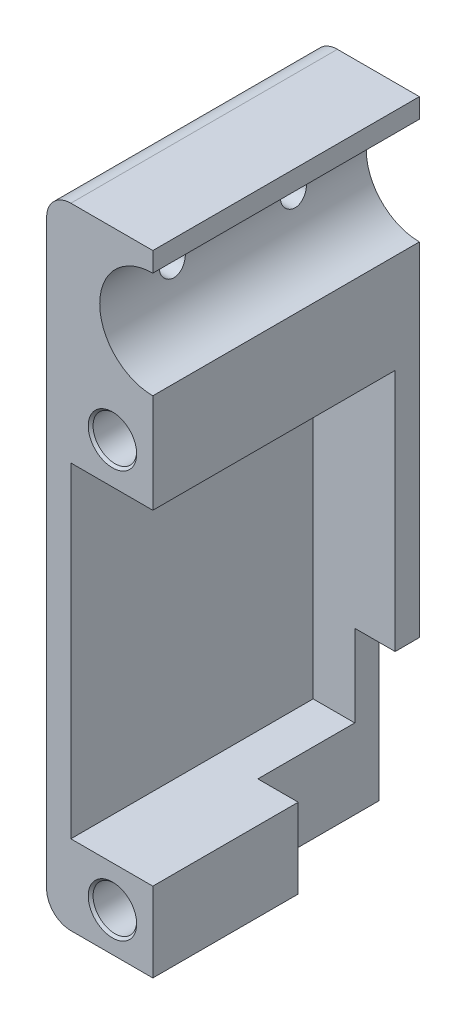
ISO-10303-21;
HEADER;
FILE_DESCRIPTION(('STEP AP214'),'2;1');
FILE_NAME('part.step','',(''),(''),'','','');
FILE_SCHEMA(('AUTOMOTIVE_DESIGN { 1 0 10303 214 1 1 1 1 }'));
ENDSEC;
DATA;
#1=APPLICATION_CONTEXT('core data for automotive mechanical design processes');
#2=APPLICATION_PROTOCOL_DEFINITION('international standard','automotive_design',2000,#1);
#3=PRODUCT_CONTEXT('',#1,'mechanical');
#4=PRODUCT('Part','Part','',(#3));
#5=PRODUCT_RELATED_PRODUCT_CATEGORY('part','',(#4));
#6=PRODUCT_DEFINITION_FORMATION('','',#4);
#7=PRODUCT_DEFINITION_CONTEXT('part definition',#1,'design');
#8=PRODUCT_DEFINITION('design','',#6,#7);
#9=PRODUCT_DEFINITION_SHAPE('','',#8);
#10=(LENGTH_UNIT() NAMED_UNIT(*) SI_UNIT(.MILLI.,.METRE.));
#11=(NAMED_UNIT(*) PLANE_ANGLE_UNIT() SI_UNIT($,.RADIAN.));
#12=(NAMED_UNIT(*) SI_UNIT($,.STERADIAN.) SOLID_ANGLE_UNIT());
#13=UNCERTAINTY_MEASURE_WITH_UNIT(LENGTH_MEASURE(1.E-05),#10,'distance_accuracy_value','');
#14=(GEOMETRIC_REPRESENTATION_CONTEXT(3) GLOBAL_UNCERTAINTY_ASSIGNED_CONTEXT((#13)) GLOBAL_UNIT_ASSIGNED_CONTEXT((#10,
#11,#12)) REPRESENTATION_CONTEXT('',''));
#15=CARTESIAN_POINT('',(0.,0.,0.));
#16=DIRECTION('',(0.,0.,1.));
#17=DIRECTION('',(1.,0.,0.));
#18=AXIS2_PLACEMENT_3D('',#15,#16,#17);
#19=CARTESIAN_POINT('',(0.,0.,0.));
#20=DIRECTION('',(-1.,0.,0.));
#21=DIRECTION('',(0.,0.,1.));
#22=AXIS2_PLACEMENT_3D('',#19,#20,#21);
#23=PLANE('',#22);
#24=DIRECTION('',(0.,1.,0.));
#25=VECTOR('',#24,1.);
#26=CARTESIAN_POINT('',(0.,0.,-33.));
#27=LINE('',#26,#25);
#28=CARTESIAN_POINT('',(0.,45.575,-33.));
#29=VERTEX_POINT('',#28);
#30=CARTESIAN_POINT('',(0.,48.,-33.));
#31=VERTEX_POINT('',#30);
#32=EDGE_CURVE('E185',#29,#31,#27,.T.);
#33=ORIENTED_EDGE('',*,*,#32,.T.);
#34=DIRECTION('',(0.,0.,1.));
#35=VECTOR('',#34,1.);
#36=CARTESIAN_POINT('',(0.,48.,-33.));
#37=LINE('',#36,#35);
#38=CARTESIAN_POINT('',(0.,48.,0.));
#39=VERTEX_POINT('',#38);
#40=EDGE_CURVE('E429',#31,#39,#37,.T.);
#41=ORIENTED_EDGE('',*,*,#40,.T.);
#42=DIRECTION('',(0.,-1.,0.));
#43=VECTOR('',#42,1.);
#44=CARTESIAN_POINT('',(0.,0.,0.));
#45=LINE('',#44,#43);
#46=CARTESIAN_POINT('',(0.,45.575,0.));
#47=VERTEX_POINT('',#46);
#48=EDGE_CURVE('E62',#39,#47,#45,.T.);
#49=ORIENTED_EDGE('',*,*,#48,.T.);
#50=DIRECTION('',(0.,0.,1.));
#51=VECTOR('',#50,1.);
#52=CARTESIAN_POINT('',(0.,45.575,-33.));
#53=LINE('',#52,#51);
#54=EDGE_CURVE('E353',#29,#47,#53,.T.);
#55=ORIENTED_EDGE('',*,*,#54,.F.);
#56=EDGE_LOOP('',(#33,#41,#49,#55));
#57=FACE_BOUND('',#56,.T.);
#58=ADVANCED_FACE('F45',(#57),#23,.F.);
#59=CARTESIAN_POINT('',(-13.15,-30.,-30.));
#60=DIRECTION('',(0.,-1.,0.));
#61=DIRECTION('',(0.,0.,-1.));
#62=AXIS2_PLACEMENT_3D('',#59,#60,#61);
#63=PLANE('',#62);
#64=DIRECTION('',(0.,0.,-1.));
#65=VECTOR('',#64,1.);
#66=CARTESIAN_POINT('',(0.,-30.,-30.));
#67=LINE('',#66,#65);
#68=CARTESIAN_POINT('',(0.,-30.,0.));
#69=VERTEX_POINT('',#68);
#70=CARTESIAN_POINT('',(0.,-30.,-18.));
#71=VERTEX_POINT('',#70);
#72=EDGE_CURVE('E70',#69,#71,#67,.T.);
#73=ORIENTED_EDGE('',*,*,#72,.F.);
#74=DIRECTION('',(1.,0.,0.));
#75=VECTOR('',#74,1.);
#76=CARTESIAN_POINT('',(-13.15,-30.,0.));
#77=LINE('',#76,#75);
#78=CARTESIAN_POINT('',(-10.15,-30.,0.));
#79=VERTEX_POINT('',#78);
#80=EDGE_CURVE('E274',#79,#69,#77,.T.);
#81=ORIENTED_EDGE('',*,*,#80,.F.);
#82=DIRECTION('',(0.,0.,1.));
#83=VECTOR('',#82,1.);
#84=CARTESIAN_POINT('',(-10.15,-30.,-30.));
#85=LINE('',#84,#83);
#86=CARTESIAN_POINT('',(-10.15,-30.,-33.));
#87=VERTEX_POINT('',#86);
#88=EDGE_CURVE('E171',#79,#87,#85,.F.);
#89=ORIENTED_EDGE('',*,*,#88,.T.);
#90=DIRECTION('',(1.,0.,0.));
#91=VECTOR('',#90,1.);
#92=CARTESIAN_POINT('',(0.,-30.,-33.));
#93=LINE('',#92,#91);
#94=CARTESIAN_POINT('',(-5.,-30.,-33.));
#95=VERTEX_POINT('',#94);
#96=EDGE_CURVE('E232',#87,#95,#93,.T.);
#97=ORIENTED_EDGE('',*,*,#96,.T.);
#98=DIRECTION('',(0.,0.,-1.));
#99=VECTOR('',#98,1.);
#100=CARTESIAN_POINT('',(-5.,-30.,-33.));
#101=LINE('',#100,#99);
#102=CARTESIAN_POINT('',(-5.,-30.,-18.));
#103=VERTEX_POINT('',#102);
#104=EDGE_CURVE('E201',#103,#95,#101,.T.);
#105=ORIENTED_EDGE('',*,*,#104,.F.);
#106=DIRECTION('',(-1.,0.,0.));
#107=VECTOR('',#106,1.);
#108=CARTESIAN_POINT('',(-5.,-30.,-18.));
#109=LINE('',#108,#107);
#110=EDGE_CURVE('E197',#71,#103,#109,.T.);
#111=ORIENTED_EDGE('',*,*,#110,.F.);
#112=EDGE_LOOP('',(#73,#81,#89,#97,#105,#111));
#113=FACE_BOUND('',#112,.T.);
#114=ADVANCED_FACE('F320',(#113),#63,.T.);
#115=CARTESIAN_POINT('',(-13.15,30.,-30.));
#116=DIRECTION('',(-1.,0.,0.));
#117=DIRECTION('',(0.,0.,1.));
#118=AXIS2_PLACEMENT_3D('',#115,#116,#117);
#119=PLANE('',#118);
#120=CARTESIAN_POINT('',(-13.15,39.,-9.));
#121=DIRECTION('',(1.,0.,0.));
#122=DIRECTION('',(0.,0.,-1.));
#123=AXIS2_PLACEMENT_3D('',#120,#121,#122);
#124=CIRCLE('',#123,1.6);
#125=CARTESIAN_POINT('',(-13.15,39.,-10.6));
#126=VERTEX_POINT('',#125);
#127=EDGE_CURVE('E291',#126,#126,#124,.T.);
#128=ORIENTED_EDGE('',*,*,#127,.T.);
#129=EDGE_LOOP('',(#128));
#130=FACE_BOUND('',#129,.T.);
#131=CARTESIAN_POINT('',(-13.15,39.,-24.));
#132=DIRECTION('',(1.,0.,0.));
#133=DIRECTION('',(0.,0.,-1.));
#134=AXIS2_PLACEMENT_3D('',#131,#132,#133);
#135=CIRCLE('',#134,1.6);
#136=CARTESIAN_POINT('',(-13.15,39.,-25.6));
#137=VERTEX_POINT('',#136);
#138=EDGE_CURVE('E432',#137,#137,#135,.T.);
#139=ORIENTED_EDGE('',*,*,#138,.T.);
#140=EDGE_LOOP('',(#139));
#141=FACE_BOUND('',#140,.T.);
#142=DIRECTION('',(0.,-1.,0.));
#143=VECTOR('',#142,1.);
#144=CARTESIAN_POINT('',(-13.15,30.,0.));
#145=LINE('',#144,#143);
#146=CARTESIAN_POINT('',(-13.15,45.,0.));
#147=VERTEX_POINT('',#146);
#148=CARTESIAN_POINT('',(-13.15,-27.,0.));
#149=VERTEX_POINT('',#148);
#150=EDGE_CURVE('E267',#147,#149,#145,.T.);
#151=ORIENTED_EDGE('',*,*,#150,.F.);
#152=DIRECTION('',(0.,0.,1.));
#153=VECTOR('',#152,1.);
#154=CARTESIAN_POINT('',(-13.15,45.,-30.));
#155=LINE('',#154,#153);
#156=CARTESIAN_POINT('',(-13.15,45.,-33.));
#157=VERTEX_POINT('',#156);
#158=EDGE_CURVE('E372',#147,#157,#155,.F.);
#159=ORIENTED_EDGE('',*,*,#158,.T.);
#160=DIRECTION('',(0.,-1.,0.));
#161=VECTOR('',#160,1.);
#162=CARTESIAN_POINT('',(-13.15,0.,-33.));
#163=LINE('',#162,#161);
#164=CARTESIAN_POINT('',(-13.15,-27.,-33.));
#165=VERTEX_POINT('',#164);
#166=EDGE_CURVE('E237',#157,#165,#163,.T.);
#167=ORIENTED_EDGE('',*,*,#166,.T.);
#168=DIRECTION('',(0.,0.,1.));
#169=VECTOR('',#168,1.);
#170=CARTESIAN_POINT('',(-13.15,-27.,-30.));
#171=LINE('',#170,#169);
#172=EDGE_CURVE('E366',#165,#149,#171,.T.);
#173=ORIENTED_EDGE('',*,*,#172,.T.);
#174=EDGE_LOOP('',(#151,#159,#167,#173));
#175=FACE_BOUND('',#174,.T.);
#176=ADVANCED_FACE('F325',(#130,#141,#175),#119,.T.);
#177=CARTESIAN_POINT('',(0.,0.,0.));
#178=DIRECTION('',(0.,0.,1.));
#179=DIRECTION('',(1.,0.,0.));
#180=AXIS2_PLACEMENT_3D('',#177,#178,#179);
#181=PLANE('',#180);
#182=CARTESIAN_POINT('',(-5.00000000000003,25.2,0.));
#183=DIRECTION('',(0.,0.,1.));
#184=DIRECTION('',(1.,0.,0.));
#185=AXIS2_PLACEMENT_3D('',#182,#183,#184);
#186=CIRCLE('',#185,3.);
#187=CARTESIAN_POINT('',(-2.00000000000003,25.2,0.));
#188=VERTEX_POINT('',#187);
#189=EDGE_CURVE('E55',#188,#188,#186,.F.);
#190=ORIENTED_EDGE('',*,*,#189,.T.);
#191=EDGE_LOOP('',(#190));
#192=FACE_BOUND('',#191,.T.);
#193=CARTESIAN_POINT('',(-5.00000000000001,-25.2,0.));
#194=DIRECTION('',(0.,0.,1.));
#195=DIRECTION('',(1.,0.,0.));
#196=AXIS2_PLACEMENT_3D('',#193,#194,#195);
#197=CIRCLE('',#196,3.);
#198=CARTESIAN_POINT('',(-2.00000000000001,-25.2,0.));
#199=VERTEX_POINT('',#198);
#200=EDGE_CURVE('E387',#199,#199,#197,.F.);
#201=ORIENTED_EDGE('',*,*,#200,.T.);
#202=EDGE_LOOP('',(#201));
#203=FACE_BOUND('',#202,.T.);
#204=ORIENTED_EDGE('',*,*,#48,.F.);
#205=DIRECTION('',(-1.,0.,0.));
#206=VECTOR('',#205,1.);
#207=CARTESIAN_POINT('',(-13.15,48.,0.));
#208=LINE('',#207,#206);
#209=CARTESIAN_POINT('',(-10.15,48.,0.));
#210=VERTEX_POINT('',#209);
#211=EDGE_CURVE('E225',#39,#210,#208,.T.);
#212=ORIENTED_EDGE('',*,*,#211,.T.);
#213=CARTESIAN_POINT('',(-10.15,45.,0.));
#214=DIRECTION('',(0.,0.,1.));
#215=DIRECTION('',(1.,0.,0.));
#216=AXIS2_PLACEMENT_3D('',#213,#214,#215);
#217=CIRCLE('',#216,3.);
#218=EDGE_CURVE('E362',#210,#147,#217,.T.);
#219=ORIENTED_EDGE('',*,*,#218,.T.);
#220=ORIENTED_EDGE('',*,*,#150,.T.);
#221=CARTESIAN_POINT('',(-10.15,-27.,0.));
#222=DIRECTION('',(0.,0.,1.));
#223=DIRECTION('',(1.,0.,0.));
#224=AXIS2_PLACEMENT_3D('',#221,#222,#223);
#225=CIRCLE('',#224,3.);
#226=EDGE_CURVE('E356',#149,#79,#225,.T.);
#227=ORIENTED_EDGE('',*,*,#226,.T.);
#228=ORIENTED_EDGE('',*,*,#80,.T.);
#229=CARTESIAN_POINT('',(0.,-20.15,0.));
#230=VERTEX_POINT('',#229);
#231=EDGE_CURVE('E340',#230,#69,#45,.T.);
#232=ORIENTED_EDGE('',*,*,#231,.F.);
#233=DIRECTION('',(1.,0.,0.));
#234=VECTOR('',#233,1.);
#235=CARTESIAN_POINT('',(-10.15,-20.15,0.));
#236=LINE('',#235,#234);
#237=CARTESIAN_POINT('',(-10.15,-20.15,0.));
#238=VERTEX_POINT('',#237);
#239=EDGE_CURVE('E246',#238,#230,#236,.T.);
#240=ORIENTED_EDGE('',*,*,#239,.F.);
#241=DIRECTION('',(0.,-1.,0.));
#242=VECTOR('',#241,1.);
#243=CARTESIAN_POINT('',(-10.15,20.15,0.));
#244=LINE('',#243,#242);
#245=CARTESIAN_POINT('',(-10.15,20.15,0.));
#246=VERTEX_POINT('',#245);
#247=EDGE_CURVE('E257',#246,#238,#244,.T.);
#248=ORIENTED_EDGE('',*,*,#247,.F.);
#249=DIRECTION('',(-1.,0.,0.));
#250=VECTOR('',#249,1.);
#251=CARTESIAN_POINT('',(-10.15,20.15,0.));
#252=LINE('',#251,#250);
#253=CARTESIAN_POINT('',(0.,20.15,0.));
#254=VERTEX_POINT('',#253);
#255=EDGE_CURVE('E241',#254,#246,#252,.T.);
#256=ORIENTED_EDGE('',*,*,#255,.F.);
#257=CARTESIAN_POINT('',(0.,32.425,0.));
#258=VERTEX_POINT('',#257);
#259=EDGE_CURVE('E347',#258,#254,#45,.T.);
#260=ORIENTED_EDGE('',*,*,#259,.F.);
#261=CARTESIAN_POINT('',(0.,39.,0.));
#262=DIRECTION('',(0.,0.,1.));
#263=DIRECTION('',(1.,0.,0.));
#264=AXIS2_PLACEMENT_3D('',#261,#262,#263);
#265=CIRCLE('',#264,6.575);
#266=EDGE_CURVE('E222',#47,#258,#265,.T.);
#267=ORIENTED_EDGE('',*,*,#266,.F.);
#268=EDGE_LOOP('',(#204,#212,#219,#220,#227,#228,#232,#240,#248,#256,#260,#267));
#269=FACE_BOUND('',#268,.T.);
#270=ADVANCED_FACE('F355',(#192,#203,#269),#181,.T.);
#271=CARTESIAN_POINT('',(-10.15,-20.15,-30.));
#272=DIRECTION('',(0.,-1.,0.));
#273=DIRECTION('',(0.,0.,-1.));
#274=AXIS2_PLACEMENT_3D('',#271,#272,#273);
#275=PLANE('',#274);
#276=ORIENTED_EDGE('',*,*,#239,.T.);
#277=DIRECTION('',(0.,0.,-1.));
#278=VECTOR('',#277,1.);
#279=CARTESIAN_POINT('',(0.,-20.15,-30.));
#280=LINE('',#279,#278);
#281=CARTESIAN_POINT('',(0.,-20.15,-18.));
#282=VERTEX_POINT('',#281);
#283=EDGE_CURVE('E342',#230,#282,#280,.T.);
#284=ORIENTED_EDGE('',*,*,#283,.T.);
#285=DIRECTION('',(-1.,0.,0.));
#286=VECTOR('',#285,1.);
#287=CARTESIAN_POINT('',(-10.15,-20.15,-18.));
#288=LINE('',#287,#286);
#289=CARTESIAN_POINT('',(-5.,-20.15,-18.));
#290=VERTEX_POINT('',#289);
#291=EDGE_CURVE('E278',#282,#290,#288,.T.);
#292=ORIENTED_EDGE('',*,*,#291,.T.);
#293=DIRECTION('',(0.,0.,-1.));
#294=VECTOR('',#293,1.);
#295=CARTESIAN_POINT('',(-5.,-20.15,-30.));
#296=LINE('',#295,#294);
#297=CARTESIAN_POINT('',(-5.,-20.15,-30.));
#298=VERTEX_POINT('',#297);
#299=EDGE_CURVE('E218',#290,#298,#296,.T.);
#300=ORIENTED_EDGE('',*,*,#299,.T.);
#301=DIRECTION('',(1.,0.,0.));
#302=VECTOR('',#301,1.);
#303=CARTESIAN_POINT('',(-10.15,-20.15,-30.));
#304=LINE('',#303,#302);
#305=CARTESIAN_POINT('',(-10.15,-20.15,-30.));
#306=VERTEX_POINT('',#305);
#307=EDGE_CURVE('E250',#306,#298,#304,.T.);
#308=ORIENTED_EDGE('',*,*,#307,.F.);
#309=DIRECTION('',(0.,0.,1.));
#310=VECTOR('',#309,1.);
#311=CARTESIAN_POINT('',(-10.15,-20.15,-30.));
#312=LINE('',#311,#310);
#313=EDGE_CURVE('E264',#306,#238,#312,.T.);
#314=ORIENTED_EDGE('',*,*,#313,.T.);
#315=EDGE_LOOP('',(#276,#284,#292,#300,#308,#314));
#316=FACE_BOUND('',#315,.T.);
#317=ADVANCED_FACE('F463',(#316),#275,.F.);
#318=CARTESIAN_POINT('',(-10.15,20.15,-30.));
#319=DIRECTION('',(-1.,0.,0.));
#320=DIRECTION('',(0.,-1.,0.));
#321=AXIS2_PLACEMENT_3D('',#318,#319,#320);
#322=PLANE('',#321);
#323=ORIENTED_EDGE('',*,*,#247,.T.);
#324=ORIENTED_EDGE('',*,*,#313,.F.);
#325=DIRECTION('',(0.,-1.,0.));
#326=VECTOR('',#325,1.);
#327=CARTESIAN_POINT('',(-10.15,20.15,-30.));
#328=LINE('',#327,#326);
#329=CARTESIAN_POINT('',(-10.15,20.15,-30.));
#330=VERTEX_POINT('',#329);
#331=EDGE_CURVE('E245',#330,#306,#328,.T.);
#332=ORIENTED_EDGE('',*,*,#331,.F.);
#333=DIRECTION('',(0.,0.,1.));
#334=VECTOR('',#333,1.);
#335=CARTESIAN_POINT('',(-10.15,20.15,-30.));
#336=LINE('',#335,#334);
#337=EDGE_CURVE('E254',#330,#246,#336,.T.);
#338=ORIENTED_EDGE('',*,*,#337,.T.);
#339=EDGE_LOOP('',(#323,#324,#332,#338));
#340=FACE_BOUND('',#339,.T.);
#341=ADVANCED_FACE('F461',(#340),#322,.F.);
#342=CARTESIAN_POINT('',(-10.15,20.15,-30.));
#343=DIRECTION('',(0.,1.,0.));
#344=DIRECTION('',(0.,0.,1.));
#345=AXIS2_PLACEMENT_3D('',#342,#343,#344);
#346=PLANE('',#345);
#347=DIRECTION('',(-1.,0.,0.));
#348=VECTOR('',#347,1.);
#349=CARTESIAN_POINT('',(-10.15,20.15,-30.));
#350=LINE('',#349,#348);
#351=CARTESIAN_POINT('',(0.,20.15,-30.));
#352=VERTEX_POINT('',#351);
#353=EDGE_CURVE('E242',#352,#330,#350,.T.);
#354=ORIENTED_EDGE('',*,*,#353,.F.);
#355=DIRECTION('',(0.,0.,1.));
#356=VECTOR('',#355,1.);
#357=CARTESIAN_POINT('',(0.,20.15,-30.));
#358=LINE('',#357,#356);
#359=EDGE_CURVE('E414',#352,#254,#358,.T.);
#360=ORIENTED_EDGE('',*,*,#359,.T.);
#361=ORIENTED_EDGE('',*,*,#255,.T.);
#362=ORIENTED_EDGE('',*,*,#337,.F.);
#363=EDGE_LOOP('',(#354,#360,#361,#362));
#364=FACE_BOUND('',#363,.T.);
#365=ADVANCED_FACE('F454',(#364),#346,.F.);
#366=CARTESIAN_POINT('',(0.,0.,-30.));
#367=DIRECTION('',(0.,0.,-1.));
#368=DIRECTION('',(-1.,0.,0.));
#369=AXIS2_PLACEMENT_3D('',#366,#367,#368);
#370=PLANE('',#369);
#371=DIRECTION('',(1.,0.,0.));
#372=VECTOR('',#371,1.);
#373=CARTESIAN_POINT('',(0.,-10.,-30.));
#374=LINE('',#373,#372);
#375=CARTESIAN_POINT('',(-5.,-10.,-30.));
#376=VERTEX_POINT('',#375);
#377=CARTESIAN_POINT('',(0.,-10.,-30.));
#378=VERTEX_POINT('',#377);
#379=EDGE_CURVE('E210',#376,#378,#374,.T.);
#380=ORIENTED_EDGE('',*,*,#379,.T.);
#381=DIRECTION('',(0.,1.,0.));
#382=VECTOR('',#381,1.);
#383=CARTESIAN_POINT('',(0.,0.,-30.));
#384=LINE('',#383,#382);
#385=EDGE_CURVE('E165',#378,#352,#384,.T.);
#386=ORIENTED_EDGE('',*,*,#385,.T.);
#387=ORIENTED_EDGE('',*,*,#353,.T.);
#388=ORIENTED_EDGE('',*,*,#331,.T.);
#389=ORIENTED_EDGE('',*,*,#307,.T.);
#390=DIRECTION('',(0.,1.,0.));
#391=VECTOR('',#390,1.);
#392=CARTESIAN_POINT('',(-5.,0.,-30.));
#393=LINE('',#392,#391);
#394=EDGE_CURVE('E214',#298,#376,#393,.T.);
#395=ORIENTED_EDGE('',*,*,#394,.T.);
#396=EDGE_LOOP('',(#380,#386,#387,#388,#389,#395));
#397=FACE_BOUND('',#396,.T.);
#398=ADVANCED_FACE('F458',(#397),#370,.F.);
#399=CARTESIAN_POINT('',(0.,0.,-33.));
#400=DIRECTION('',(0.,0.,-1.));
#401=DIRECTION('',(-1.,0.,0.));
#402=AXIS2_PLACEMENT_3D('',#399,#400,#401);
#403=PLANE('',#402);
#404=CARTESIAN_POINT('',(0.,-10.,-33.));
#405=VERTEX_POINT('',#404);
#406=CARTESIAN_POINT('',(0.,32.425,-33.));
#407=VERTEX_POINT('',#406);
#408=EDGE_CURVE('E162',#405,#407,#27,.T.);
#409=ORIENTED_EDGE('',*,*,#408,.F.);
#410=DIRECTION('',(1.,0.,0.));
#411=VECTOR('',#410,1.);
#412=CARTESIAN_POINT('',(-5.,-10.,-33.));
#413=LINE('',#412,#411);
#414=CARTESIAN_POINT('',(-5.,-10.,-33.));
#415=VERTEX_POINT('',#414);
#416=EDGE_CURVE('E178',#415,#405,#413,.T.);
#417=ORIENTED_EDGE('',*,*,#416,.F.);
#418=DIRECTION('',(0.,-1.,0.));
#419=VECTOR('',#418,1.);
#420=CARTESIAN_POINT('',(-5.,-10.,-33.));
#421=LINE('',#420,#419);
#422=EDGE_CURVE('E191',#415,#95,#421,.T.);
#423=ORIENTED_EDGE('',*,*,#422,.T.);
#424=ORIENTED_EDGE('',*,*,#96,.F.);
#425=CARTESIAN_POINT('',(-10.15,-27.,-33.));
#426=DIRECTION('',(0.,0.,-1.));
#427=DIRECTION('',(-1.,0.,0.));
#428=AXIS2_PLACEMENT_3D('',#425,#426,#427);
#429=CIRCLE('',#428,3.);
#430=EDGE_CURVE('E375',#87,#165,#429,.T.);
#431=ORIENTED_EDGE('',*,*,#430,.T.);
#432=ORIENTED_EDGE('',*,*,#166,.F.);
#433=CARTESIAN_POINT('',(-10.15,45.,-33.));
#434=DIRECTION('',(0.,0.,-1.));
#435=DIRECTION('',(-1.,0.,0.));
#436=AXIS2_PLACEMENT_3D('',#433,#434,#435);
#437=CIRCLE('',#436,3.);
#438=CARTESIAN_POINT('',(-10.15,48.,-33.));
#439=VERTEX_POINT('',#438);
#440=EDGE_CURVE('E378',#157,#439,#437,.T.);
#441=ORIENTED_EDGE('',*,*,#440,.T.);
#442=DIRECTION('',(-1.,0.,0.));
#443=VECTOR('',#442,1.);
#444=CARTESIAN_POINT('',(-13.15,48.,-33.));
#445=LINE('',#444,#443);
#446=EDGE_CURVE('E229',#31,#439,#445,.T.);
#447=ORIENTED_EDGE('',*,*,#446,.F.);
#448=ORIENTED_EDGE('',*,*,#32,.F.);
#449=CARTESIAN_POINT('',(0.,39.,-33.));
#450=DIRECTION('',(0.,0.,1.));
#451=DIRECTION('',(1.,0.,0.));
#452=AXIS2_PLACEMENT_3D('',#449,#450,#451);
#453=CIRCLE('',#452,6.575);
#454=EDGE_CURVE('E181',#29,#407,#453,.T.);
#455=ORIENTED_EDGE('',*,*,#454,.T.);
#456=EDGE_LOOP('',(#409,#417,#423,#424,#431,#432,#441,#447,#448,#455));
#457=FACE_BOUND('',#456,.T.);
#458=ADVANCED_FACE('F176',(#457),#403,.T.);
#459=CARTESIAN_POINT('',(-13.15,48.,-33.));
#460=DIRECTION('',(0.,1.,0.));
#461=DIRECTION('',(0.,0.,1.));
#462=AXIS2_PLACEMENT_3D('',#459,#460,#461);
#463=PLANE('',#462);
#464=ORIENTED_EDGE('',*,*,#40,.F.);
#465=ORIENTED_EDGE('',*,*,#446,.T.);
#466=DIRECTION('',(0.,0.,1.));
#467=VECTOR('',#466,1.);
#468=CARTESIAN_POINT('',(-10.15,48.,-33.));
#469=LINE('',#468,#467);
#470=EDGE_CURVE('E281',#439,#210,#469,.T.);
#471=ORIENTED_EDGE('',*,*,#470,.T.);
#472=ORIENTED_EDGE('',*,*,#211,.F.);
#473=EDGE_LOOP('',(#464,#465,#471,#472));
#474=FACE_BOUND('',#473,.T.);
#475=ADVANCED_FACE('F445',(#474),#463,.T.);
#476=CARTESIAN_POINT('',(0.,39.,-33.));
#477=DIRECTION('',(0.,0.,1.));
#478=DIRECTION('',(1.,0.,0.));
#479=AXIS2_PLACEMENT_3D('',#476,#477,#478);
#480=CYLINDRICAL_SURFACE('',#479,6.575);
#481=CARTESIAN_POINT('',(-6.575,39.,-10.6));
#482=CARTESIAN_POINT('',(-6.57499845812546,38.9115232230347,-10.5999973843847));
#483=CARTESIAN_POINT('',(-6.57319623895143,38.8230167309233,-10.592636405716));
#484=CARTESIAN_POINT('',(-6.56618132587017,38.6485353269209,-10.5634280394686));
#485=CARTESIAN_POINT('',(-6.56096658685481,38.5625619654318,-10.5415719649368));
#486=CARTESIAN_POINT('',(-6.54770479659433,38.3956921149242,-10.4841123295918));
#487=CARTESIAN_POINT('',(-6.53966105017736,38.3147898312802,-10.4485248050799));
#488=CARTESIAN_POINT('',(-6.52160045146386,38.160104275199,-10.364667689876));
#489=CARTESIAN_POINT('',(-6.51158355819305,38.0863211506453,-10.3163978358163));
#490=CARTESIAN_POINT('',(-6.49044694266934,37.9465223740568,-10.2075470467382));
#491=CARTESIAN_POINT('',(-6.47931092859564,37.8806660755727,-10.1467646028299));
#492=CARTESIAN_POINT('',(-6.45730083279449,37.7599746598786,-10.0150457174888));
#493=CARTESIAN_POINT('',(-6.44642677926855,37.7051407246616,-9.94410818846155));
#494=CARTESIAN_POINT('',(-6.42600841474534,37.6073115275609,-9.79286867078688));
#495=CARTESIAN_POINT('',(-6.41648483228485,37.5644925976423,-9.71244957004042));
#496=CARTESIAN_POINT('',(-6.4000825112725,37.4930421878624,-9.54528588006634));
#497=CARTESIAN_POINT('',(-6.3932033742103,37.4644085701271,-9.45854224627347));
#498=CARTESIAN_POINT('',(-6.383035956021,37.422681445431,-9.28293900768695));
#499=CARTESIAN_POINT('',(-6.37968178293266,37.4093023660488,-9.19415116330816));
#500=CARTESIAN_POINT('',(-6.37674668912483,37.3975749185499,-9.01553270627259));
#501=CARTESIAN_POINT('',(-6.37716518867643,37.3992242410897,-8.92570225594686));
#502=CARTESIAN_POINT('',(-6.38166882838071,37.4172784974141,-8.74972224455398));
#503=CARTESIAN_POINT('',(-6.38566988933193,37.433345090651,-8.66353548668221));
#504=CARTESIAN_POINT('',(-6.39675407861578,37.4792389155901,-8.49511887584151));
#505=CARTESIAN_POINT('',(-6.40383741620411,37.5090670815734,-8.41288929194607));
#506=CARTESIAN_POINT('',(-6.42036647441597,37.5819305881245,-8.25380422881629));
#507=CARTESIAN_POINT('',(-6.42983428601899,37.6250903369289,-8.17700812204271));
#508=CARTESIAN_POINT('',(-6.45005280313921,37.7233047582952,-8.03162607783183));
#509=CARTESIAN_POINT('',(-6.46080372210161,37.7783614111479,-7.96304151019786));
#510=CARTESIAN_POINT('',(-6.48273263305275,37.9005679550596,-7.83408840288492));
#511=CARTESIAN_POINT('',(-6.49391432457523,37.9680038707181,-7.77399122835646));
#512=CARTESIAN_POINT('',(-6.5151829414571,38.1121293828612,-7.66590883687698));
#513=CARTESIAN_POINT('',(-6.52526983673713,38.1888192334739,-7.61792395266117));
#514=CARTESIAN_POINT('',(-6.54325834104884,38.3496503094528,-7.53533601886063));
#515=CARTESIAN_POINT('',(-6.55115304213529,38.4338140107179,-7.50077513696578));
#516=CARTESIAN_POINT('',(-6.56381722036521,38.6069910044723,-7.44636636936192));
#517=CARTESIAN_POINT('',(-6.56858726303233,38.696003416246,-7.42651582118312));
#518=CARTESIAN_POINT('',(-6.57438169072042,38.8740293081337,-7.40250121036162));
#519=CARTESIAN_POINT('',(-6.57549435696976,38.9629901047436,-7.3979673591594));
#520=CARTESIAN_POINT('',(-6.5740992000999,39.1403988895848,-7.40370327755246));
#521=CARTESIAN_POINT('',(-6.57159168469191,39.2288469207589,-7.4139717889641));
#522=CARTESIAN_POINT('',(-6.56329430066877,39.4014477950685,-7.4487156614656));
#523=CARTESIAN_POINT('',(-6.55755066712109,39.4856433211071,-7.47299101913313));
#524=CARTESIAN_POINT('',(-6.54342716418923,39.6487639540486,-7.53483249300966));
#525=CARTESIAN_POINT('',(-6.53504703693657,39.7276885444994,-7.57239990932456));
#526=CARTESIAN_POINT('',(-6.51636709531477,39.8795112006565,-7.66048766367626));
#527=CARTESIAN_POINT('',(-6.50603706232543,39.952283975353,-7.71121738579481));
#528=CARTESIAN_POINT('',(-6.48465368434698,40.0884153970316,-7.82392033157357));
#529=CARTESIAN_POINT('',(-6.47360022163206,40.151772506261,-7.88589538814253));
#530=CARTESIAN_POINT('',(-6.45170078511468,40.2687844725669,-8.02104273484734));
#531=CARTESIAN_POINT('',(-6.44086554811612,40.3221805987448,-8.09444113864895));
#532=CARTESIAN_POINT('',(-6.42091659028909,40.4158954097893,-8.24937657318806));
#533=CARTESIAN_POINT('',(-6.41180279245474,40.4562146796864,-8.33091323962361));
#534=CARTESIAN_POINT('',(-6.39642666741019,40.522334976028,-8.49936787717004));
#535=CARTESIAN_POINT('',(-6.39014751587844,40.5482218835631,-8.58625052399842));
#536=CARTESIAN_POINT('',(-6.38113167032648,40.5849758406438,-8.76330960749367));
#537=CARTESIAN_POINT('',(-6.37839424973492,40.5958459708498,-8.85348536468847));
#538=CARTESIAN_POINT('',(-6.37682509903874,40.6021032899228,-9.03194380906534));
#539=CARTESIAN_POINT('',(-6.37788925348801,40.5979031997027,-9.12021134750422));
#540=CARTESIAN_POINT('',(-6.38356380009835,40.5750789917384,-9.29473926740857));
#541=CARTESIAN_POINT('',(-6.38817412809809,40.5564551349649,-9.38099968516001));
#542=CARTESIAN_POINT('',(-6.40036509266722,40.5055319151394,-9.54864298916278));
#543=CARTESIAN_POINT('',(-6.40792973684196,40.4733061079748,-9.63004946098425));
#544=CARTESIAN_POINT('',(-6.42518003154588,40.3961526699719,-9.78635666803599));
#545=CARTESIAN_POINT('',(-6.43486596065891,40.3512233705852,-9.8612565469631));
#546=CARTESIAN_POINT('',(-6.45556751905836,40.2486277735135,-10.0044279569998));
#547=CARTESIAN_POINT('',(-6.46661015974412,40.1906733297159,-10.0724891352384));
#548=CARTESIAN_POINT('',(-6.48861540770691,40.0642391947034,-10.198054744054));
#549=CARTESIAN_POINT('',(-6.49957799551182,39.9957570265499,-10.2555566832724));
#550=CARTESIAN_POINT('',(-6.52040893410985,39.8488138391775,-10.3593162756733));
#551=CARTESIAN_POINT('',(-6.53025564637718,39.7702036586424,-10.4053673431871));
#552=CARTESIAN_POINT('',(-6.54751992894247,39.6061269850563,-10.4835275969054));
#553=CARTESIAN_POINT('',(-6.55493930661092,39.5206656526143,-10.5156471622073));
#554=CARTESIAN_POINT('',(-6.56536456530072,39.3627494859293,-10.5600477990556));
#555=CARTESIAN_POINT('',(-6.56895359350318,39.291071828326,-10.5749983723984));
#556=CARTESIAN_POINT('',(-6.5737718687407,39.1462694849428,-10.5949752198917));
#557=CARTESIAN_POINT('',(-6.57500127468765,39.0731448969435,-10.6000021623631));
#558=CARTESIAN_POINT('',(-6.575,39.,-10.6));
#559=B_SPLINE_CURVE_WITH_KNOTS('',3,(#481,#482,#483,#484,#485,#486,#487,#488,#489,#490,#491,
#492,#493,#494,#495,#496,#497,#498,#499,#500,#501,#502,#503,#504,#505,#506,#507,#508,#509,#510,
#511,#512,#513,#514,#515,#516,#517,#518,#519,#520,#521,#522,#523,#524,#525,#526,#527,#528,#529,
#530,#531,#532,#533,#534,#535,#536,#537,#538,#539,#540,#541,#542,#543,#544,#545,#546,#547,#548,
#549,#550,#551,#552,#553,#554,#555,#556,#557,#558),.UNSPECIFIED.,.T.,.F.,(4,2,2,2,2,2,2,2,2,2,2,
2,2,2,2,2,2,2,2,2,2,2,2,2,2,2,2,2,2,2,2,2,2,2,2,2,2,2,4),(0.,0.265162352874569,
0.530483762090009,0.795496248452426,1.0605142386339,1.33019119998975,1.59989706498755,
1.87337564757774,2.14681300155735,2.41504280227029,2.6832313860719,2.94528618843334,
3.20735878446702,3.47195491797952,3.73659512863225,4.00837028192078,4.28015290029804,
4.5527824725003,4.82536268855485,5.09131312263471,5.35724095256923,5.61946239949348,
5.88170950158136,6.14841573420929,6.41516547715078,6.68809404963639,6.96101041019657,
7.23228493348456,7.50350379710498,7.76735229971497,8.03119602859539,8.29363087734482,
8.55610021179436,8.82507633488767,9.09411583919116,9.36770484682939,9.64108967656525,
9.86031759120941,10.0795307411405),.UNSPECIFIED.);
#560=CARTESIAN_POINT('',(-6.575,39.,-10.6));
#561=VERTEX_POINT('',#560);
#562=EDGE_CURVE('E205',#561,#561,#559,.T.);
#563=ORIENTED_EDGE('',*,*,#562,.T.);
#564=EDGE_LOOP('',(#563));
#565=FACE_BOUND('',#564,.T.);
#566=CARTESIAN_POINT('',(-6.575,39.,-25.6));
#567=CARTESIAN_POINT('',(-6.57499845812546,38.9115232230347,-25.5999973843847));
#568=CARTESIAN_POINT('',(-6.57319623895143,38.8230167309233,-25.592636405716));
#569=CARTESIAN_POINT('',(-6.56618132587017,38.6485353269209,-25.5634280394685));
#570=CARTESIAN_POINT('',(-6.56096658685481,38.5625619654317,-25.5415719649368));
#571=CARTESIAN_POINT('',(-6.54770479659433,38.3956921149242,-25.4841123295918));
#572=CARTESIAN_POINT('',(-6.53966105017736,38.3147898312802,-25.4485248050799));
#573=CARTESIAN_POINT('',(-6.52160045146386,38.160104275199,-25.364667689876));
#574=CARTESIAN_POINT('',(-6.51158355819304,38.0863211506453,-25.3163978358163));
#575=CARTESIAN_POINT('',(-6.49044694266934,37.9465223740568,-25.2075470467382));
#576=CARTESIAN_POINT('',(-6.47931092859564,37.8806660755727,-25.1467646028299));
#577=CARTESIAN_POINT('',(-6.45730083279449,37.7599746598786,-25.0150457174888));
#578=CARTESIAN_POINT('',(-6.44642677926855,37.7051407246616,-24.9441081884615));
#579=CARTESIAN_POINT('',(-6.42600841474534,37.6073115275609,-24.7928686707869));
#580=CARTESIAN_POINT('',(-6.41648483228484,37.5644925976423,-24.7124495700404));
#581=CARTESIAN_POINT('',(-6.4000825112725,37.4930421878623,-24.5452858800663));
#582=CARTESIAN_POINT('',(-6.3932033742103,37.4644085701271,-24.4585422462735));
#583=CARTESIAN_POINT('',(-6.38303595602099,37.422681445431,-24.2829390076869));
#584=CARTESIAN_POINT('',(-6.37968178293266,37.4093023660488,-24.1941511633082));
#585=CARTESIAN_POINT('',(-6.37674668912482,37.3975749185499,-24.0155327062726));
#586=CARTESIAN_POINT('',(-6.37716518867643,37.3992242410897,-23.9257022559469));
#587=CARTESIAN_POINT('',(-6.3816688283807,37.4172784974141,-23.749722244554));
#588=CARTESIAN_POINT('',(-6.38566988933193,37.433345090651,-23.6635354866822));
#589=CARTESIAN_POINT('',(-6.39675407861578,37.4792389155901,-23.4951188758415));
#590=CARTESIAN_POINT('',(-6.40383741620411,37.5090670815734,-23.4128892919461));
#591=CARTESIAN_POINT('',(-6.42036647441597,37.5819305881245,-23.2538042288163));
#592=CARTESIAN_POINT('',(-6.42983428601899,37.6250903369289,-23.1770081220427));
#593=CARTESIAN_POINT('',(-6.4500528031392,37.7233047582951,-23.0316260778318));
#594=CARTESIAN_POINT('',(-6.46080372210161,37.7783614111478,-22.9630415101979));
#595=CARTESIAN_POINT('',(-6.48273263305274,37.9005679550596,-22.8340884028849));
#596=CARTESIAN_POINT('',(-6.49391432457523,37.9680038707181,-22.7739912283565));
#597=CARTESIAN_POINT('',(-6.5151829414571,38.1121293828612,-22.665908836877));
#598=CARTESIAN_POINT('',(-6.52526983673713,38.1888192334739,-22.6179239526612));
#599=CARTESIAN_POINT('',(-6.54325834104884,38.3496503094528,-22.5353360188606));
#600=CARTESIAN_POINT('',(-6.55115304213529,38.4338140107179,-22.5007751369658));
#601=CARTESIAN_POINT('',(-6.56381722036521,38.6069910044723,-22.4463663693619));
#602=CARTESIAN_POINT('',(-6.56858726303233,38.696003416246,-22.4265158211831));
#603=CARTESIAN_POINT('',(-6.57438169072042,38.8740293081337,-22.4025012103616));
#604=CARTESIAN_POINT('',(-6.57549435696976,38.9629901047436,-22.3979673591594));
#605=CARTESIAN_POINT('',(-6.5740992000999,39.1403988895848,-22.4037032775525));
#606=CARTESIAN_POINT('',(-6.57159168469191,39.2288469207589,-22.4139717889641));
#607=CARTESIAN_POINT('',(-6.56329430066877,39.4014477950685,-22.4487156614656));
#608=CARTESIAN_POINT('',(-6.55755066712109,39.4856433211071,-22.4729910191331));
#609=CARTESIAN_POINT('',(-6.54342716418923,39.6487639540486,-22.5348324930097));
#610=CARTESIAN_POINT('',(-6.53504703693657,39.7276885444994,-22.5723999093246));
#611=CARTESIAN_POINT('',(-6.51636709531477,39.8795112006565,-22.6604876636763));
#612=CARTESIAN_POINT('',(-6.50603706232543,39.952283975353,-22.7112173857948));
#613=CARTESIAN_POINT('',(-6.48465368434698,40.0884153970316,-22.8239203315736));
#614=CARTESIAN_POINT('',(-6.47360022163206,40.151772506261,-22.8858953881425));
#615=CARTESIAN_POINT('',(-6.45170078511468,40.2687844725669,-23.0210427348473));
#616=CARTESIAN_POINT('',(-6.44086554811612,40.3221805987448,-23.0944411386489));
#617=CARTESIAN_POINT('',(-6.42091659028909,40.4158954097893,-23.2493765731881));
#618=CARTESIAN_POINT('',(-6.41180279245474,40.4562146796864,-23.3309132396236));
#619=CARTESIAN_POINT('',(-6.3964266674102,40.522334976028,-23.49936787717));
#620=CARTESIAN_POINT('',(-6.39014751587844,40.5482218835631,-23.5862505239984));
#621=CARTESIAN_POINT('',(-6.38113167032648,40.5849758406438,-23.7633096074937));
#622=CARTESIAN_POINT('',(-6.37839424973492,40.5958459708498,-23.8534853646885));
#623=CARTESIAN_POINT('',(-6.37682509903875,40.6021032899228,-24.0319438090653));
#624=CARTESIAN_POINT('',(-6.37788925348802,40.5979031997027,-24.1202113475042));
#625=CARTESIAN_POINT('',(-6.38356380009835,40.5750789917384,-24.2947392674086));
#626=CARTESIAN_POINT('',(-6.38817412809809,40.5564551349649,-24.38099968516));
#627=CARTESIAN_POINT('',(-6.40036509266723,40.5055319151394,-24.5486429891628));
#628=CARTESIAN_POINT('',(-6.40792973684196,40.4733061079748,-24.6300494609842));
#629=CARTESIAN_POINT('',(-6.42518003154588,40.3961526699719,-24.786356668036));
#630=CARTESIAN_POINT('',(-6.43486596065891,40.3512233705852,-24.8612565469631));
#631=CARTESIAN_POINT('',(-6.45556751905836,40.2486277735135,-25.0044279569998));
#632=CARTESIAN_POINT('',(-6.46661015974412,40.1906733297159,-25.0724891352384));
#633=CARTESIAN_POINT('',(-6.48861540770691,40.0642391947034,-25.198054744054));
#634=CARTESIAN_POINT('',(-6.49957799551182,39.9957570265499,-25.2555566832724));
#635=CARTESIAN_POINT('',(-6.52040893410985,39.8488138391775,-25.3593162756733));
#636=CARTESIAN_POINT('',(-6.53025564637718,39.7702036586424,-25.4053673431871));
#637=CARTESIAN_POINT('',(-6.54751992894247,39.6061269850563,-25.4835275969054));
#638=CARTESIAN_POINT('',(-6.55493930661092,39.5206656526143,-25.5156471622073));
#639=CARTESIAN_POINT('',(-6.56536456530072,39.3627494859293,-25.5600477990556));
#640=CARTESIAN_POINT('',(-6.56895359350318,39.291071828326,-25.5749983723984));
#641=CARTESIAN_POINT('',(-6.5737718687407,39.1462694849428,-25.5949752198917));
#642=CARTESIAN_POINT('',(-6.57500127468765,39.0731448969435,-25.6000021623631));
#643=CARTESIAN_POINT('',(-6.575,39.,-25.6));
#644=B_SPLINE_CURVE_WITH_KNOTS('',3,(#566,#567,#568,#569,#570,#571,#572,#573,#574,#575,#576,
#577,#578,#579,#580,#581,#582,#583,#584,#585,#586,#587,#588,#589,#590,#591,#592,#593,#594,#595,
#596,#597,#598,#599,#600,#601,#602,#603,#604,#605,#606,#607,#608,#609,#610,#611,#612,#613,#614,
#615,#616,#617,#618,#619,#620,#621,#622,#623,#624,#625,#626,#627,#628,#629,#630,#631,#632,#633,
#634,#635,#636,#637,#638,#639,#640,#641,#642,#643),.UNSPECIFIED.,.T.,.F.,(4,2,2,2,2,2,2,2,2,2,2,
2,2,2,2,2,2,2,2,2,2,2,2,2,2,2,2,2,2,2,2,2,2,2,2,2,2,2,4),(0.,0.265162352874569,0.53048376209001,
0.795496248452432,1.0605142386339,1.33019119998975,1.59989706498755,1.87337564757774,
2.14681300155735,2.41504280227029,2.6832313860719,2.94528618843334,3.20735878446702,
3.47195491797953,3.73659512863225,4.00837028192078,4.28015290029804,4.5527824725003,
4.82536268855485,5.09131312263472,5.35724095256923,5.61946239949349,5.88170950158136,
6.14841573420929,6.41516547715078,6.68809404963639,6.96101041019657,7.23228493348456,
7.50350379710497,7.76735229971496,8.03119602859538,8.29363087734482,8.55610021179436,
8.82507633488767,9.09411583919116,9.3677048468294,9.64108967656526,9.86031759120942,
10.0795307411405),.UNSPECIFIED.);
#645=CARTESIAN_POINT('',(-6.575,39.,-25.6));
#646=VERTEX_POINT('',#645);
#647=EDGE_CURVE('E282',#646,#646,#644,.T.);
#648=ORIENTED_EDGE('',*,*,#647,.T.);
#649=EDGE_LOOP('',(#648));
#650=FACE_BOUND('',#649,.T.);
#651=ORIENTED_EDGE('',*,*,#266,.T.);
#652=DIRECTION('',(0.,0.,1.));
#653=VECTOR('',#652,1.);
#654=CARTESIAN_POINT('',(0.,32.425,-33.));
#655=LINE('',#654,#653);
#656=EDGE_CURVE('E419',#258,#407,#655,.F.);
#657=ORIENTED_EDGE('',*,*,#656,.T.);
#658=ORIENTED_EDGE('',*,*,#454,.F.);
#659=ORIENTED_EDGE('',*,*,#54,.T.);
#660=EDGE_LOOP('',(#651,#657,#658,#659));
#661=FACE_BOUND('',#660,.T.);
#662=ADVANCED_FACE('F297',(#565,#650,#661),#480,.F.);
#663=CARTESIAN_POINT('',(-5.,-10.,-18.));
#664=DIRECTION('',(0.,0.,1.));
#665=DIRECTION('',(1.,0.,0.));
#666=AXIS2_PLACEMENT_3D('',#663,#664,#665);
#667=PLANE('',#666);
#668=ORIENTED_EDGE('',*,*,#291,.F.);
#669=DIRECTION('',(0.,-1.,0.));
#670=VECTOR('',#669,1.);
#671=CARTESIAN_POINT('',(0.,-10.,-18.));
#672=LINE('',#671,#670);
#673=EDGE_CURVE('E422',#282,#71,#672,.T.);
#674=ORIENTED_EDGE('',*,*,#673,.T.);
#675=ORIENTED_EDGE('',*,*,#110,.T.);
#676=DIRECTION('',(0.,-1.,0.));
#677=VECTOR('',#676,1.);
#678=CARTESIAN_POINT('',(-5.,-10.,-18.));
#679=LINE('',#678,#677);
#680=EDGE_CURVE('E195',#290,#103,#679,.T.);
#681=ORIENTED_EDGE('',*,*,#680,.F.);
#682=EDGE_LOOP('',(#668,#674,#675,#681));
#683=FACE_BOUND('',#682,.T.);
#684=ADVANCED_FACE('F312',(#683),#667,.F.);
#685=CARTESIAN_POINT('',(-5.,-10.,-33.));
#686=DIRECTION('',(-1.,0.,0.));
#687=DIRECTION('',(0.,0.,1.));
#688=AXIS2_PLACEMENT_3D('',#685,#686,#687);
#689=PLANE('',#688);
#690=ORIENTED_EDGE('',*,*,#680,.T.);
#691=ORIENTED_EDGE('',*,*,#104,.T.);
#692=ORIENTED_EDGE('',*,*,#422,.F.);
#693=DIRECTION('',(0.,0.,-1.));
#694=VECTOR('',#693,1.);
#695=CARTESIAN_POINT('',(-5.,-10.,-33.));
#696=LINE('',#695,#694);
#697=EDGE_CURVE('E189',#376,#415,#696,.T.);
#698=ORIENTED_EDGE('',*,*,#697,.F.);
#699=ORIENTED_EDGE('',*,*,#394,.F.);
#700=ORIENTED_EDGE('',*,*,#299,.F.);
#701=EDGE_LOOP('',(#690,#691,#692,#698,#699,#700));
#702=FACE_BOUND('',#701,.T.);
#703=ADVANCED_FACE('F311',(#702),#689,.F.);
#704=CARTESIAN_POINT('',(0.,-10.,0.));
#705=DIRECTION('',(0.,1.,0.));
#706=DIRECTION('',(0.,0.,1.));
#707=AXIS2_PLACEMENT_3D('',#704,#705,#706);
#708=PLANE('',#707);
#709=ORIENTED_EDGE('',*,*,#416,.T.);
#710=DIRECTION('',(0.,0.,1.));
#711=VECTOR('',#710,1.);
#712=CARTESIAN_POINT('',(0.,-10.,0.));
#713=LINE('',#712,#711);
#714=EDGE_CURVE('E159',#405,#378,#713,.T.);
#715=ORIENTED_EDGE('',*,*,#714,.T.);
#716=ORIENTED_EDGE('',*,*,#379,.F.);
#717=ORIENTED_EDGE('',*,*,#697,.T.);
#718=EDGE_LOOP('',(#709,#715,#716,#717));
#719=FACE_BOUND('',#718,.T.);
#720=ADVANCED_FACE('F187',(#719),#708,.F.);
#721=CARTESIAN_POINT('',(-13.15,39.,-24.));
#722=DIRECTION('',(1.,0.,0.));
#723=DIRECTION('',(0.,0.,-1.));
#724=AXIS2_PLACEMENT_3D('',#721,#722,#723);
#725=CYLINDRICAL_SURFACE('',#724,1.6);
#726=ORIENTED_EDGE('',*,*,#138,.F.);
#727=EDGE_LOOP('',(#726));
#728=FACE_BOUND('',#727,.T.);
#729=ORIENTED_EDGE('',*,*,#647,.F.);
#730=EDGE_LOOP('',(#729));
#731=FACE_BOUND('',#730,.T.);
#732=ADVANCED_FACE('F301',(#728,#731),#725,.F.);
#733=CARTESIAN_POINT('',(-13.15,39.,-9.));
#734=DIRECTION('',(1.,0.,0.));
#735=DIRECTION('',(0.,0.,-1.));
#736=AXIS2_PLACEMENT_3D('',#733,#734,#735);
#737=CYLINDRICAL_SURFACE('',#736,1.6);
#738=ORIENTED_EDGE('',*,*,#127,.F.);
#739=EDGE_LOOP('',(#738));
#740=FACE_BOUND('',#739,.T.);
#741=ORIENTED_EDGE('',*,*,#562,.F.);
#742=EDGE_LOOP('',(#741));
#743=FACE_BOUND('',#742,.T.);
#744=ADVANCED_FACE('F305',(#740,#743),#737,.F.);
#745=CARTESIAN_POINT('',(-10.15,45.,-33.));
#746=DIRECTION('',(0.,0.,1.));
#747=DIRECTION('',(1.,0.,0.));
#748=AXIS2_PLACEMENT_3D('',#745,#746,#747);
#749=CYLINDRICAL_SURFACE('',#748,3.);
#750=ORIENTED_EDGE('',*,*,#440,.F.);
#751=ORIENTED_EDGE('',*,*,#158,.F.);
#752=ORIENTED_EDGE('',*,*,#218,.F.);
#753=ORIENTED_EDGE('',*,*,#470,.F.);
#754=EDGE_LOOP('',(#750,#751,#752,#753));
#755=FACE_BOUND('',#754,.T.);
#756=ADVANCED_FACE('F474',(#755),#749,.T.);
#757=CARTESIAN_POINT('',(-10.15,-27.,-30.));
#758=DIRECTION('',(0.,0.,1.));
#759=DIRECTION('',(1.,0.,0.));
#760=AXIS2_PLACEMENT_3D('',#757,#758,#759);
#761=CYLINDRICAL_SURFACE('',#760,3.);
#762=ORIENTED_EDGE('',*,*,#430,.F.);
#763=ORIENTED_EDGE('',*,*,#88,.F.);
#764=ORIENTED_EDGE('',*,*,#226,.F.);
#765=ORIENTED_EDGE('',*,*,#172,.F.);
#766=EDGE_LOOP('',(#762,#763,#764,#765));
#767=FACE_BOUND('',#766,.T.);
#768=ADVANCED_FACE('F330',(#767),#761,.T.);
#769=ORIENTED_EDGE('',*,*,#656,.F.);
#770=ORIENTED_EDGE('',*,*,#259,.T.);
#771=ORIENTED_EDGE('',*,*,#359,.F.);
#772=ORIENTED_EDGE('',*,*,#385,.F.);
#773=ORIENTED_EDGE('',*,*,#714,.F.);
#774=ORIENTED_EDGE('',*,*,#408,.T.);
#775=EDGE_LOOP('',(#769,#770,#771,#772,#773,#774));
#776=FACE_BOUND('',#775,.T.);
#777=ADVANCED_FACE('F161',(#776),#23,.F.);
#778=ORIENTED_EDGE('',*,*,#231,.T.);
#779=ORIENTED_EDGE('',*,*,#72,.T.);
#780=ORIENTED_EDGE('',*,*,#673,.F.);
#781=ORIENTED_EDGE('',*,*,#283,.F.);
#782=EDGE_LOOP('',(#778,#779,#780,#781));
#783=FACE_BOUND('',#782,.T.);
#784=ADVANCED_FACE('F321',(#783),#23,.F.);
#785=CARTESIAN_POINT('',(-5.00000000000003,25.2,-4.2));
#786=DIRECTION('',(0.,0.,1.));
#787=DIRECTION('',(1.,0.,0.));
#788=AXIS2_PLACEMENT_3D('',#785,#786,#787);
#789=CYLINDRICAL_SURFACE('',#788,2.7);
#790=CARTESIAN_POINT('',(-5.00000000000003,25.2,-0.299999999999991));
#791=DIRECTION('',(0.,0.,1.));
#792=DIRECTION('',(1.,0.,0.));
#793=AXIS2_PLACEMENT_3D('',#790,#791,#792);
#794=CIRCLE('',#793,2.7);
#795=CARTESIAN_POINT('',(-2.30000000000003,25.2,-0.299999999999991));
#796=VERTEX_POINT('',#795);
#797=EDGE_CURVE('E170',#796,#796,#794,.T.);
#798=ORIENTED_EDGE('',*,*,#797,.T.);
#799=EDGE_LOOP('',(#798));
#800=FACE_BOUND('',#799,.T.);
#801=CARTESIAN_POINT('',(-5.00000000000003,25.2,-4.2));
#802=DIRECTION('',(0.,0.,1.));
#803=DIRECTION('',(1.,0.,0.));
#804=AXIS2_PLACEMENT_3D('',#801,#802,#803);
#805=CIRCLE('',#804,2.7);
#806=CARTESIAN_POINT('',(-2.30000000000003,25.2,-4.2));
#807=VERTEX_POINT('',#806);
#808=EDGE_CURVE('E404',#807,#807,#805,.T.);
#809=ORIENTED_EDGE('',*,*,#808,.F.);
#810=EDGE_LOOP('',(#809));
#811=FACE_BOUND('',#810,.T.);
#812=ADVANCED_FACE('F332',(#800,#811),#789,.F.);
#813=CARTESIAN_POINT('',(-5.00000000000003,25.2,-4.2));
#814=DIRECTION('',(0.,0.,1.));
#815=DIRECTION('',(1.,0.,0.));
#816=AXIS2_PLACEMENT_3D('',#813,#814,#815);
#817=PLANE('',#816);
#818=ORIENTED_EDGE('',*,*,#808,.T.);
#819=EDGE_LOOP('',(#818));
#820=FACE_BOUND('',#819,.T.);
#821=ADVANCED_FACE('F336',(#820),#817,.T.);
#822=CARTESIAN_POINT('',(-5.00000000000001,-25.2,-4.2));
#823=DIRECTION('',(0.,0.,1.));
#824=DIRECTION('',(1.,0.,0.));
#825=AXIS2_PLACEMENT_3D('',#822,#823,#824);
#826=CYLINDRICAL_SURFACE('',#825,2.7);
#827=CARTESIAN_POINT('',(-5.00000000000001,-25.2,-0.299999999999991));
#828=DIRECTION('',(0.,0.,1.));
#829=DIRECTION('',(1.,0.,0.));
#830=AXIS2_PLACEMENT_3D('',#827,#828,#829);
#831=CIRCLE('',#830,2.7);
#832=CARTESIAN_POINT('',(-2.30000000000001,-25.2,-0.299999999999991));
#833=VERTEX_POINT('',#832);
#834=EDGE_CURVE('E12',#833,#833,#831,.T.);
#835=ORIENTED_EDGE('',*,*,#834,.T.);
#836=EDGE_LOOP('',(#835));
#837=FACE_BOUND('',#836,.T.);
#838=CARTESIAN_POINT('',(-5.00000000000001,-25.2,-4.2));
#839=DIRECTION('',(0.,0.,1.));
#840=DIRECTION('',(1.,0.,0.));
#841=AXIS2_PLACEMENT_3D('',#838,#839,#840);
#842=CIRCLE('',#841,2.7);
#843=CARTESIAN_POINT('',(-2.30000000000001,-25.2,-4.2));
#844=VERTEX_POINT('',#843);
#845=EDGE_CURVE('E183',#844,#844,#842,.T.);
#846=ORIENTED_EDGE('',*,*,#845,.F.);
#847=EDGE_LOOP('',(#846));
#848=FACE_BOUND('',#847,.T.);
#849=ADVANCED_FACE('F537',(#837,#848),#826,.F.);
#850=CARTESIAN_POINT('',(-5.00000000000001,-25.2,-4.2));
#851=DIRECTION('',(0.,0.,1.));
#852=DIRECTION('',(1.,0.,0.));
#853=AXIS2_PLACEMENT_3D('',#850,#851,#852);
#854=PLANE('',#853);
#855=ORIENTED_EDGE('',*,*,#845,.T.);
#856=EDGE_LOOP('',(#855));
#857=FACE_BOUND('',#856,.T.);
#858=ADVANCED_FACE('F399',(#857),#854,.T.);
#859=CARTESIAN_POINT('',(-5.00000000000003,25.2,-0.299999999999991));
#860=DIRECTION('',(0.,0.,1.));
#861=DIRECTION('',(1.,0.,0.));
#862=AXIS2_PLACEMENT_3D('',#859,#860,#861);
#863=CONICAL_SURFACE('',#862,2.7,0.785398163397469);
#864=ORIENTED_EDGE('',*,*,#189,.F.);
#865=EDGE_LOOP('',(#864));
#866=FACE_BOUND('',#865,.T.);
#867=ORIENTED_EDGE('',*,*,#797,.F.);
#868=EDGE_LOOP('',(#867));
#869=FACE_BOUND('',#868,.T.);
#870=ADVANCED_FACE('F396',(#866,#869),#863,.F.);
#871=CARTESIAN_POINT('',(-5.00000000000001,-25.2,-0.299999999999991));
#872=DIRECTION('',(0.,0.,1.));
#873=DIRECTION('',(1.,0.,0.));
#874=AXIS2_PLACEMENT_3D('',#871,#872,#873);
#875=CONICAL_SURFACE('',#874,2.7,0.785398163397467);
#876=ORIENTED_EDGE('',*,*,#200,.F.);
#877=EDGE_LOOP('',(#876));
#878=FACE_BOUND('',#877,.T.);
#879=ORIENTED_EDGE('',*,*,#834,.F.);
#880=EDGE_LOOP('',(#879));
#881=FACE_BOUND('',#880,.T.);
#882=ADVANCED_FACE('F48',(#878,#881),#875,.F.);
#883=CLOSED_SHELL('',(#58,#114,#176,#270,#317,#341,#365,#398,#458,#475,#662,#684,#703,#720,#732,
#744,#756,#768,#777,#784,#812,#821,#849,#858,#870,#882));
#884=MANIFOLD_SOLID_BREP('B2',#883);
#885=ADVANCED_BREP_SHAPE_REPRESENTATION('',(#18,#884),#14);
#886=SHAPE_DEFINITION_REPRESENTATION(#9,#885);
ENDSEC;
END-ISO-10303-21;
